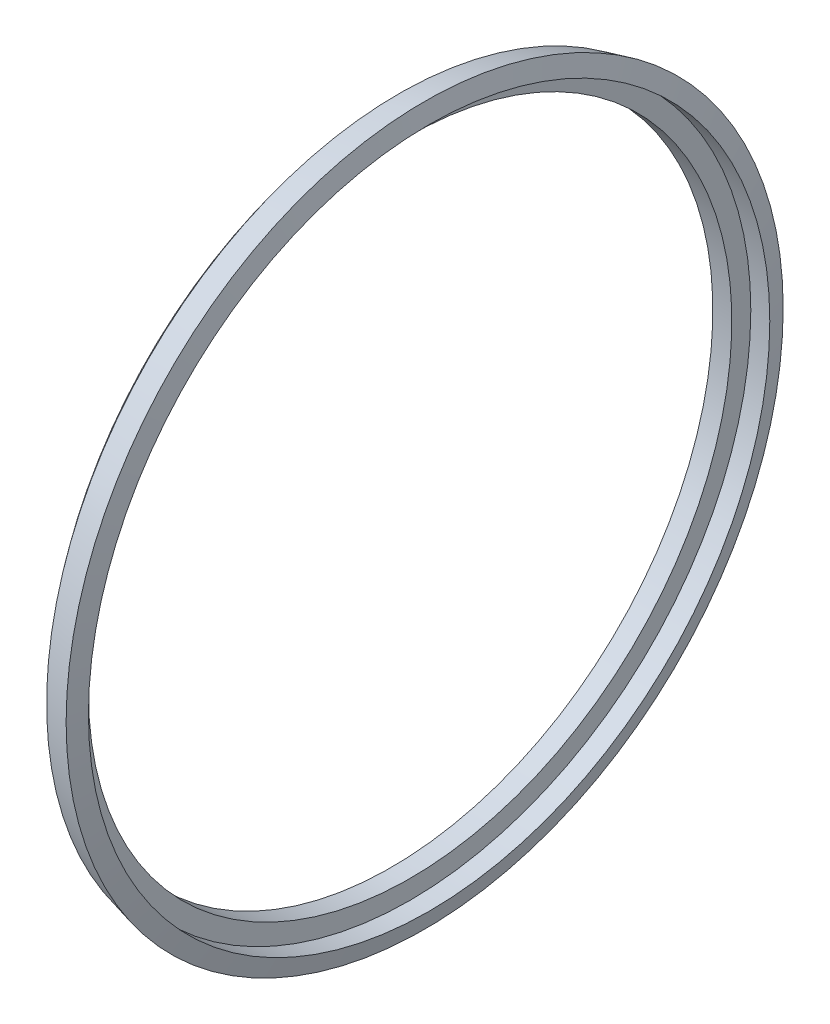
ISO-10303-21;
HEADER;
FILE_DESCRIPTION(('STEP AP214'),'2;1');
FILE_NAME('part.step','',(''),(''),'','','');
FILE_SCHEMA(('AUTOMOTIVE_DESIGN { 1 0 10303 214 1 1 1 1 }'));
ENDSEC;
DATA;
#1=APPLICATION_CONTEXT('core data for automotive mechanical design processes');
#2=APPLICATION_PROTOCOL_DEFINITION('international standard','automotive_design',2000,#1);
#3=PRODUCT_CONTEXT('',#1,'mechanical');
#4=PRODUCT('Part','Part','',(#3));
#5=PRODUCT_RELATED_PRODUCT_CATEGORY('part','',(#4));
#6=PRODUCT_DEFINITION_FORMATION('','',#4);
#7=PRODUCT_DEFINITION_CONTEXT('part definition',#1,'design');
#8=PRODUCT_DEFINITION('design','',#6,#7);
#9=PRODUCT_DEFINITION_SHAPE('','',#8);
#10=(LENGTH_UNIT() NAMED_UNIT(*) SI_UNIT(.MILLI.,.METRE.));
#11=(NAMED_UNIT(*) PLANE_ANGLE_UNIT() SI_UNIT($,.RADIAN.));
#12=(NAMED_UNIT(*) SI_UNIT($,.STERADIAN.) SOLID_ANGLE_UNIT());
#13=UNCERTAINTY_MEASURE_WITH_UNIT(LENGTH_MEASURE(1.E-05),#10,'distance_accuracy_value','');
#14=(GEOMETRIC_REPRESENTATION_CONTEXT(3) GLOBAL_UNCERTAINTY_ASSIGNED_CONTEXT((#13)) GLOBAL_UNIT_ASSIGNED_CONTEXT((#10,
#11,#12)) REPRESENTATION_CONTEXT('',''));
#15=CARTESIAN_POINT('',(0.,0.,0.));
#16=DIRECTION('',(0.,0.,1.));
#17=DIRECTION('',(1.,0.,0.));
#18=AXIS2_PLACEMENT_3D('',#15,#16,#17);
#19=CARTESIAN_POINT('',(49.9999999999997,4.44089209850063E-13,0.));
#20=DIRECTION('',(-1.,0.,0.));
#21=DIRECTION('',(0.,0.,1.));
#22=AXIS2_PLACEMENT_3D('',#19,#20,#21);
#23=CYLINDRICAL_SURFACE('',#22,22.761333333333);
#24=CARTESIAN_POINT('',(0.570999999999766,8.88178419700125E-13,-1.11022302462516E-13));
#25=DIRECTION('',(-1.,0.,0.));
#26=DIRECTION('',(0.,0.,1.));
#27=AXIS2_PLACEMENT_3D('',#24,#25,#26);
#28=CIRCLE('',#27,22.761333333333);
#29=CARTESIAN_POINT('',(0.570999999999758,8.67962294629858E-13,22.7613333333329));
#30=VERTEX_POINT('',#29);
#31=EDGE_CURVE('E30',#30,#30,#28,.T.);
#32=ORIENTED_EDGE('',*,*,#31,.F.);
#33=EDGE_LOOP('',(#32));
#34=FACE_BOUND('',#33,.T.);
#35=CARTESIAN_POINT('',(-0.696833333333258,0.,0.));
#36=DIRECTION('',(-1.,0.,0.));
#37=DIRECTION('',(0.,0.,1.));
#38=AXIS2_PLACEMENT_3D('',#35,#36,#37);
#39=CIRCLE('',#38,22.761333333333);
#40=CARTESIAN_POINT('',(-0.696833333333265,0.,22.761333333333));
#41=VERTEX_POINT('',#40);
#42=EDGE_CURVE('E18',#41,#41,#39,.T.);
#43=ORIENTED_EDGE('',*,*,#42,.T.);
#44=EDGE_LOOP('',(#43));
#45=FACE_BOUND('',#44,.T.);
#46=ADVANCED_FACE('F15',(#34,#45),#23,.F.);
#47=CARTESIAN_POINT('',(0.272686274509715,0.,0.));
#48=DIRECTION('',(-1.,0.,0.));
#49=DIRECTION('',(0.,0.,1.));
#50=AXIS2_PLACEMENT_3D('',#47,#48,#49);
#51=CONICAL_SURFACE('',#50,23.954588235294,1.32581766366807);
#52=ORIENTED_EDGE('',*,*,#31,.T.);
#53=EDGE_LOOP('',(#52));
#54=FACE_BOUND('',#53,.T.);
#55=CARTESIAN_POINT('',(0.272686274509715,0.,0.));
#56=DIRECTION('',(1.,0.,0.));
#57=DIRECTION('',(0.,0.,-1.));
#58=AXIS2_PLACEMENT_3D('',#55,#56,#57);
#59=CIRCLE('',#58,23.954588235294);
#60=CARTESIAN_POINT('',(0.272686274509723,0.,-23.954588235294));
#61=VERTEX_POINT('',#60);
#62=EDGE_CURVE('E34',#61,#61,#59,.F.);
#63=ORIENTED_EDGE('',*,*,#62,.F.);
#64=EDGE_LOOP('',(#63));
#65=FACE_BOUND('',#64,.T.);
#66=ADVANCED_FACE('F48',(#54,#65),#51,.T.);
#67=CARTESIAN_POINT('',(-0.696833333333591,21.4935000000001,-4.44089209850063E-13));
#68=DIRECTION('',(-1.,0.,0.));
#69=DIRECTION('',(0.,0.,1.));
#70=AXIS2_PLACEMENT_3D('',#67,#68,#69);
#71=PLANE('',#70);
#72=CARTESIAN_POINT('',(-0.696833333333258,0.,0.));
#73=DIRECTION('',(-1.,0.,0.));
#74=DIRECTION('',(0.,0.,1.));
#75=AXIS2_PLACEMENT_3D('',#72,#73,#74);
#76=CIRCLE('',#75,21.4935);
#77=CARTESIAN_POINT('',(-0.696833333333265,0.,21.4935));
#78=VERTEX_POINT('',#77);
#79=EDGE_CURVE('E32',#78,#78,#76,.T.);
#80=ORIENTED_EDGE('',*,*,#79,.T.);
#81=EDGE_LOOP('',(#80));
#82=FACE_BOUND('',#81,.T.);
#83=ORIENTED_EDGE('',*,*,#42,.F.);
#84=EDGE_LOOP('',(#83));
#85=FACE_BOUND('',#84,.T.);
#86=ADVANCED_FACE('F56',(#82,#85),#71,.F.);
#87=CARTESIAN_POINT('',(0.272686274509715,0.,0.));
#88=DIRECTION('',(1.,0.,0.));
#89=DIRECTION('',(0.,0.,-1.));
#90=AXIS2_PLACEMENT_3D('',#87,#88,#89);
#91=CONICAL_SURFACE('',#90,23.954588235294,0.244978663126757);
#92=CARTESIAN_POINT('',(-1.46501010275124,6.66133814775094E-13,-1.11022302462516E-13));
#93=DIRECTION('',(1.,0.,0.));
#94=DIRECTION('',(0.,0.,-1.));
#95=AXIS2_PLACEMENT_3D('',#92,#93,#94);
#96=CIRCLE('',#95,23.520164140979);
#97=CARTESIAN_POINT('',(-1.46501010275123,6.87023916992916E-13,-23.5201641409791));
#98=VERTEX_POINT('',#97);
#99=EDGE_CURVE('E27',#98,#98,#96,.F.);
#100=ORIENTED_EDGE('',*,*,#99,.F.);
#101=EDGE_LOOP('',(#100));
#102=FACE_BOUND('',#101,.T.);
#103=ORIENTED_EDGE('',*,*,#62,.T.);
#104=EDGE_LOOP('',(#103));
#105=FACE_BOUND('',#104,.T.);
#106=ADVANCED_FACE('F71',(#102,#105),#91,.T.);
#107=CARTESIAN_POINT('',(49.9999999999997,4.44089209850063E-13,0.));
#108=DIRECTION('',(-1.,0.,0.));
#109=DIRECTION('',(0.,0.,1.));
#110=AXIS2_PLACEMENT_3D('',#107,#108,#109);
#111=CYLINDRICAL_SURFACE('',#110,21.4935);
#112=ORIENTED_EDGE('',*,*,#79,.F.);
#113=EDGE_LOOP('',(#112));
#114=FACE_BOUND('',#113,.T.);
#115=CARTESIAN_POINT('',(-1.96466666666695,0.,0.));
#116=DIRECTION('',(-1.,0.,0.));
#117=DIRECTION('',(0.,0.,1.));
#118=AXIS2_PLACEMENT_3D('',#115,#116,#117);
#119=CIRCLE('',#118,21.4935);
#120=CARTESIAN_POINT('',(-1.96466666666695,0.,21.4935));
#121=VERTEX_POINT('',#120);
#122=EDGE_CURVE('E22',#121,#121,#119,.T.);
#123=ORIENTED_EDGE('',*,*,#122,.T.);
#124=EDGE_LOOP('',(#123));
#125=FACE_BOUND('',#124,.T.);
#126=ADVANCED_FACE('F65',(#114,#125),#111,.F.);
#127=CARTESIAN_POINT('',(-1.46501010275124,6.66133814775094E-13,-1.11022302462516E-13));
#128=DIRECTION('',(1.,0.,0.));
#129=DIRECTION('',(0.,0.,-1.));
#130=AXIS2_PLACEMENT_3D('',#127,#128,#129);
#131=CONICAL_SURFACE('',#130,23.520164140979,0.90788749496063);
#132=CARTESIAN_POINT('',(-1.96466666666695,0.,0.));
#133=DIRECTION('',(1.,0.,0.));
#134=DIRECTION('',(0.,0.,-1.));
#135=AXIS2_PLACEMENT_3D('',#132,#133,#134);
#136=CIRCLE('',#135,22.880215802611);
#137=CARTESIAN_POINT('',(-1.96466666666694,0.,-22.880215802611));
#138=VERTEX_POINT('',#137);
#139=EDGE_CURVE('E10',#138,#138,#136,.T.);
#140=ORIENTED_EDGE('',*,*,#139,.T.);
#141=EDGE_LOOP('',(#140));
#142=FACE_BOUND('',#141,.T.);
#143=ORIENTED_EDGE('',*,*,#99,.T.);
#144=EDGE_LOOP('',(#143));
#145=FACE_BOUND('',#144,.T.);
#146=ADVANCED_FACE('F59',(#142,#145),#131,.T.);
#147=CARTESIAN_POINT('',(-1.96466666666706,22.8802158026111,-4.44089209850063E-13));
#148=DIRECTION('',(1.,0.,0.));
#149=DIRECTION('',(0.,0.,-1.));
#150=AXIS2_PLACEMENT_3D('',#147,#148,#149);
#151=PLANE('',#150);
#152=ORIENTED_EDGE('',*,*,#139,.F.);
#153=EDGE_LOOP('',(#152));
#154=FACE_BOUND('',#153,.T.);
#155=ORIENTED_EDGE('',*,*,#122,.F.);
#156=EDGE_LOOP('',(#155));
#157=FACE_BOUND('',#156,.T.);
#158=ADVANCED_FACE('F57',(#154,#157),#151,.F.);
#159=CLOSED_SHELL('',(#46,#66,#86,#106,#126,#146,#158));
#160=MANIFOLD_SOLID_BREP('B1',#159);
#161=ADVANCED_BREP_SHAPE_REPRESENTATION('',(#18,#160),#14);
#162=SHAPE_DEFINITION_REPRESENTATION(#9,#161);
ENDSEC;
END-ISO-10303-21;
